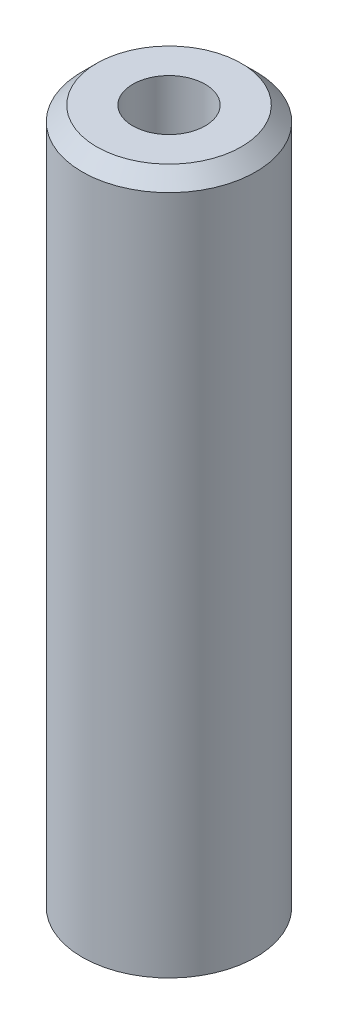
ISO-10303-21;
HEADER;
FILE_DESCRIPTION(('STEP AP214'),'2;1');
FILE_NAME('part.step','',(''),(''),'','','');
FILE_SCHEMA(('AUTOMOTIVE_DESIGN { 1 0 10303 214 1 1 1 1 }'));
ENDSEC;
DATA;
#1=APPLICATION_CONTEXT('core data for automotive mechanical design processes');
#2=APPLICATION_PROTOCOL_DEFINITION('international standard','automotive_design',2000,#1);
#3=PRODUCT_CONTEXT('',#1,'mechanical');
#4=PRODUCT('Part','Part','',(#3));
#5=PRODUCT_RELATED_PRODUCT_CATEGORY('part','',(#4));
#6=PRODUCT_DEFINITION_FORMATION('','',#4);
#7=PRODUCT_DEFINITION_CONTEXT('part definition',#1,'design');
#8=PRODUCT_DEFINITION('design','',#6,#7);
#9=PRODUCT_DEFINITION_SHAPE('','',#8);
#10=(LENGTH_UNIT() NAMED_UNIT(*) SI_UNIT(.MILLI.,.METRE.));
#11=(NAMED_UNIT(*) PLANE_ANGLE_UNIT() SI_UNIT($,.RADIAN.));
#12=(NAMED_UNIT(*) SI_UNIT($,.STERADIAN.) SOLID_ANGLE_UNIT());
#13=UNCERTAINTY_MEASURE_WITH_UNIT(LENGTH_MEASURE(1.E-05),#10,'distance_accuracy_value','');
#14=(GEOMETRIC_REPRESENTATION_CONTEXT(3) GLOBAL_UNCERTAINTY_ASSIGNED_CONTEXT((#13)) GLOBAL_UNIT_ASSIGNED_CONTEXT((#10,
#11,#12)) REPRESENTATION_CONTEXT('',''));
#15=CARTESIAN_POINT('',(0.,0.,0.));
#16=DIRECTION('',(0.,0.,1.));
#17=DIRECTION('',(1.,0.,0.));
#18=AXIS2_PLACEMENT_3D('',#15,#16,#17);
#19=CARTESIAN_POINT('',(5.00000000000001,48.,0.));
#20=DIRECTION('',(0.,-1.,0.));
#21=DIRECTION('',(0.,0.,-1.));
#22=AXIS2_PLACEMENT_3D('',#19,#20,#21);
#23=PLANE('',#22);
#24=CARTESIAN_POINT('',(0.,48.,0.));
#25=DIRECTION('',(0.,1.,0.));
#26=DIRECTION('',(0.,0.,1.));
#27=AXIS2_PLACEMENT_3D('',#24,#25,#26);
#28=CIRCLE('',#27,2.5);
#29=CARTESIAN_POINT('',(0.,48.,2.5));
#30=VERTEX_POINT('',#29);
#31=EDGE_CURVE('E58',#30,#30,#28,.T.);
#32=ORIENTED_EDGE('',*,*,#31,.F.);
#33=EDGE_LOOP('',(#32));
#34=FACE_BOUND('',#33,.T.);
#35=CARTESIAN_POINT('',(0.,48.,0.));
#36=DIRECTION('',(0.,1.,0.));
#37=DIRECTION('',(0.,0.,1.));
#38=AXIS2_PLACEMENT_3D('',#35,#36,#37);
#39=CIRCLE('',#38,5.00000000000001);
#40=CARTESIAN_POINT('',(0.,48.,5.00000000000001));
#41=VERTEX_POINT('',#40);
#42=EDGE_CURVE('E57',#41,#41,#39,.T.);
#43=ORIENTED_EDGE('',*,*,#42,.T.);
#44=EDGE_LOOP('',(#43));
#45=FACE_BOUND('',#44,.T.);
#46=ADVANCED_FACE('F38',(#34,#45),#23,.F.);
#47=CARTESIAN_POINT('',(0.,0.,0.));
#48=DIRECTION('',(0.,1.,0.));
#49=DIRECTION('',(0.,0.,1.));
#50=AXIS2_PLACEMENT_3D('',#47,#48,#49);
#51=PLANE('',#50);
#52=CARTESIAN_POINT('',(0.,0.,0.));
#53=DIRECTION('',(0.,1.,0.));
#54=DIRECTION('',(0.,0.,1.));
#55=AXIS2_PLACEMENT_3D('',#52,#53,#54);
#56=CIRCLE('',#55,6.);
#57=CARTESIAN_POINT('',(0.,0.,6.));
#58=VERTEX_POINT('',#57);
#59=EDGE_CURVE('E11',#58,#58,#56,.T.);
#60=ORIENTED_EDGE('',*,*,#59,.F.);
#61=EDGE_LOOP('',(#60));
#62=FACE_BOUND('',#61,.T.);
#63=ADVANCED_FACE('F71',(#62),#51,.F.);
#64=CARTESIAN_POINT('',(0.,48.,0.));
#65=DIRECTION('',(0.,1.,0.));
#66=DIRECTION('',(0.,0.,1.));
#67=AXIS2_PLACEMENT_3D('',#64,#65,#66);
#68=CYLINDRICAL_SURFACE('',#67,6.);
#69=CARTESIAN_POINT('',(0.,47.,0.));
#70=DIRECTION('',(0.,1.,0.));
#71=DIRECTION('',(0.,0.,1.));
#72=AXIS2_PLACEMENT_3D('',#69,#70,#71);
#73=CIRCLE('',#72,6.);
#74=CARTESIAN_POINT('',(0.,47.,6.));
#75=VERTEX_POINT('',#74);
#76=EDGE_CURVE('E44',#75,#75,#73,.T.);
#77=ORIENTED_EDGE('',*,*,#76,.F.);
#78=EDGE_LOOP('',(#77));
#79=FACE_BOUND('',#78,.T.);
#80=ORIENTED_EDGE('',*,*,#59,.T.);
#81=EDGE_LOOP('',(#80));
#82=FACE_BOUND('',#81,.T.);
#83=ADVANCED_FACE('F68',(#79,#82),#68,.T.);
#84=CARTESIAN_POINT('',(0.,47.,0.));
#85=DIRECTION('',(0.,-1.,0.));
#86=DIRECTION('',(0.,0.,-1.));
#87=AXIS2_PLACEMENT_3D('',#84,#85,#86);
#88=CONICAL_SURFACE('',#87,6.,0.785398163397448);
#89=ORIENTED_EDGE('',*,*,#42,.F.);
#90=EDGE_LOOP('',(#89));
#91=FACE_BOUND('',#90,.T.);
#92=ORIENTED_EDGE('',*,*,#76,.T.);
#93=EDGE_LOOP('',(#92));
#94=FACE_BOUND('',#93,.T.);
#95=ADVANCED_FACE('F51',(#91,#94),#88,.T.);
#96=CARTESIAN_POINT('',(0.,38.,0.));
#97=DIRECTION('',(0.,1.,0.));
#98=DIRECTION('',(0.,0.,1.));
#99=AXIS2_PLACEMENT_3D('',#96,#97,#98);
#100=CONICAL_SURFACE('',#99,2.5,1.02974425867665);
#101=CARTESIAN_POINT('',(0.,36.4978484524311,0.));
#102=VERTEX_POINT('',#101);
#103=VERTEX_LOOP('',#102);
#104=FACE_BOUND('',#103,.T.);
#105=CARTESIAN_POINT('',(0.,38.,0.));
#106=DIRECTION('',(0.,1.,0.));
#107=DIRECTION('',(0.,0.,1.));
#108=AXIS2_PLACEMENT_3D('',#105,#106,#107);
#109=CIRCLE('',#108,2.5);
#110=CARTESIAN_POINT('',(0.,38.,2.5));
#111=VERTEX_POINT('',#110);
#112=EDGE_CURVE('E55',#111,#111,#109,.T.);
#113=ORIENTED_EDGE('',*,*,#112,.T.);
#114=EDGE_LOOP('',(#113));
#115=FACE_BOUND('',#114,.T.);
#116=ADVANCED_FACE('F47',(#104,#115),#100,.F.);
#117=CARTESIAN_POINT('',(0.,48.,0.));
#118=DIRECTION('',(0.,1.,0.));
#119=DIRECTION('',(0.,0.,1.));
#120=AXIS2_PLACEMENT_3D('',#117,#118,#119);
#121=CYLINDRICAL_SURFACE('',#120,2.5);
#122=ORIENTED_EDGE('',*,*,#112,.F.);
#123=EDGE_LOOP('',(#122));
#124=FACE_BOUND('',#123,.T.);
#125=ORIENTED_EDGE('',*,*,#31,.T.);
#126=EDGE_LOOP('',(#125));
#127=FACE_BOUND('',#126,.T.);
#128=ADVANCED_FACE('F50',(#124,#127),#121,.F.);
#129=CLOSED_SHELL('',(#46,#63,#83,#95,#116,#128));
#130=MANIFOLD_SOLID_BREP('B2',#129);
#131=ADVANCED_BREP_SHAPE_REPRESENTATION('',(#18,#130),#14);
#132=SHAPE_DEFINITION_REPRESENTATION(#9,#131);
ENDSEC;
END-ISO-10303-21;
